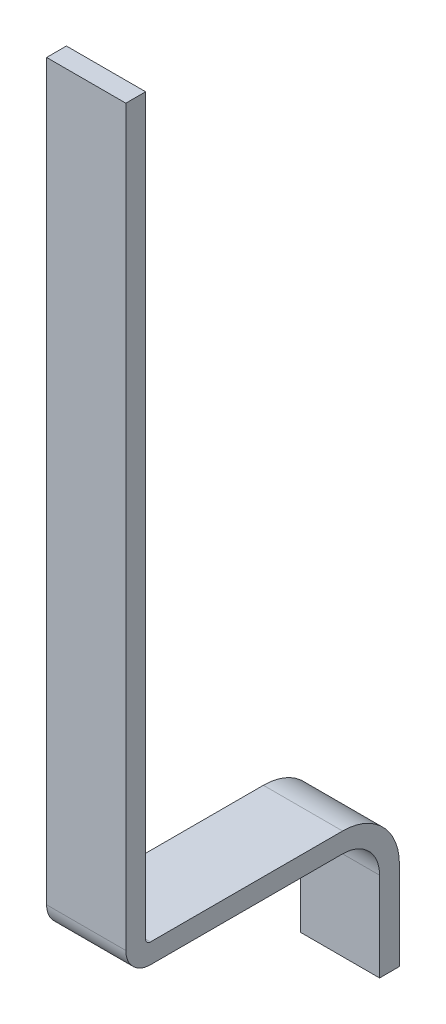
ISO-10303-21;
HEADER;
FILE_DESCRIPTION(('STEP AP214'),'2;1');
FILE_NAME('part.step','',(''),(''),'','','');
FILE_SCHEMA(('AUTOMOTIVE_DESIGN { 1 0 10303 214 1 1 1 1 }'));
ENDSEC;
DATA;
#1=APPLICATION_CONTEXT('core data for automotive mechanical design processes');
#2=APPLICATION_PROTOCOL_DEFINITION('international standard','automotive_design',2000,#1);
#3=PRODUCT_CONTEXT('',#1,'mechanical');
#4=PRODUCT('Part','Part','',(#3));
#5=PRODUCT_RELATED_PRODUCT_CATEGORY('part','',(#4));
#6=PRODUCT_DEFINITION_FORMATION('','',#4);
#7=PRODUCT_DEFINITION_CONTEXT('part definition',#1,'design');
#8=PRODUCT_DEFINITION('design','',#6,#7);
#9=PRODUCT_DEFINITION_SHAPE('','',#8);
#10=(LENGTH_UNIT() NAMED_UNIT(*) SI_UNIT(.MILLI.,.METRE.));
#11=(NAMED_UNIT(*) PLANE_ANGLE_UNIT() SI_UNIT($,.RADIAN.));
#12=(NAMED_UNIT(*) SI_UNIT($,.STERADIAN.) SOLID_ANGLE_UNIT());
#13=UNCERTAINTY_MEASURE_WITH_UNIT(LENGTH_MEASURE(1.E-05),#10,'distance_accuracy_value','');
#14=(GEOMETRIC_REPRESENTATION_CONTEXT(3) GLOBAL_UNCERTAINTY_ASSIGNED_CONTEXT((#13)) GLOBAL_UNIT_ASSIGNED_CONTEXT((#10,
#11,#12)) REPRESENTATION_CONTEXT('',''));
#15=CARTESIAN_POINT('',(0.,0.,0.));
#16=DIRECTION('',(0.,0.,1.));
#17=DIRECTION('',(1.,0.,0.));
#18=AXIS2_PLACEMENT_3D('',#15,#16,#17);
#19=CARTESIAN_POINT('',(0.4,-0.643753640552,-0.07458478699637));
#20=DIRECTION('',(1.,0.,0.));
#21=DIRECTION('',(0.,-1.,0.));
#22=AXIS2_PLACEMENT_3D('',#19,#20,#21);
#23=PLANE('',#22);
#24=DIRECTION('',(0.,1.,0.));
#25=VECTOR('',#24,1.);
#26=CARTESIAN_POINT('',(0.4,-1.805851747482,0.16));
#27=LINE('',#26,#25);
#28=CARTESIAN_POINT('',(0.4,-1.805851747482,0.16));
#29=VERTEX_POINT('',#28);
#30=CARTESIAN_POINT('',(0.4,1.9,0.16));
#31=VERTEX_POINT('',#30);
#32=EDGE_CURVE('E153',#29,#31,#27,.T.);
#33=ORIENTED_EDGE('',*,*,#32,.T.);
#34=DIRECTION('',(0.,0.,1.));
#35=VECTOR('',#34,1.);
#36=CARTESIAN_POINT('',(0.4,1.9,0.16));
#37=LINE('',#36,#35);
#38=CARTESIAN_POINT('',(0.4,1.9,0.26));
#39=VERTEX_POINT('',#38);
#40=EDGE_CURVE('E174',#31,#39,#37,.T.);
#41=ORIENTED_EDGE('',*,*,#40,.T.);
#42=DIRECTION('',(0.,-1.,0.));
#43=VECTOR('',#42,1.);
#44=CARTESIAN_POINT('',(0.4,1.9,0.26));
#45=LINE('',#44,#43);
#46=CARTESIAN_POINT('',(0.4,-1.805851747482,0.26));
#47=VERTEX_POINT('',#46);
#48=EDGE_CURVE('E183',#39,#47,#45,.T.);
#49=ORIENTED_EDGE('',*,*,#48,.T.);
#50=CARTESIAN_POINT('',(0.4,-1.805851747482,0.135287023696));
#51=DIRECTION('',(1.,0.,0.));
#52=DIRECTION('',(0.,1.,0.));
#53=AXIS2_PLACEMENT_3D('',#50,#51,#52);
#54=CIRCLE('',#53,0.124712976304);
#55=CARTESIAN_POINT('',(0.4,-1.930564723786,0.135287023696));
#56=VERTEX_POINT('',#55);
#57=EDGE_CURVE('E162',#47,#56,#54,.T.);
#58=ORIENTED_EDGE('',*,*,#57,.T.);
#59=DIRECTION('',(0.,0.,-1.));
#60=VECTOR('',#59,1.);
#61=CARTESIAN_POINT('',(0.4,-1.930564723786,0.135287023696));
#62=LINE('',#61,#60);
#63=CARTESIAN_POINT('',(0.4,-1.930564723786,-0.834763344159));
#64=VERTEX_POINT('',#63);
#65=EDGE_CURVE('E210',#56,#64,#62,.T.);
#66=ORIENTED_EDGE('',*,*,#65,.T.);
#67=CARTESIAN_POINT('',(0.4,-2.117351316963,-0.834763344159));
#68=DIRECTION('',(1.,0.,0.));
#69=DIRECTION('',(0.,1.,0.));
#70=AXIS2_PLACEMENT_3D('',#67,#68,#69);
#71=CIRCLE('',#70,0.186786593177);
#72=CARTESIAN_POINT('',(0.4,-2.117351316963,-1.021549937336));
#73=VERTEX_POINT('',#72);
#74=EDGE_CURVE('E191',#73,#64,#71,.T.);
#75=ORIENTED_EDGE('',*,*,#74,.F.);
#76=DIRECTION('',(0.,-1.,0.));
#77=VECTOR('',#76,1.);
#78=CARTESIAN_POINT('',(0.4,-2.117351316963,-1.021549937336));
#79=LINE('',#78,#77);
#80=CARTESIAN_POINT('',(0.4,-2.566872544918,-1.021549937336));
#81=VERTEX_POINT('',#80);
#82=EDGE_CURVE('E232',#73,#81,#79,.T.);
#83=ORIENTED_EDGE('',*,*,#82,.T.);
#84=DIRECTION('',(0.,0.,-1.));
#85=VECTOR('',#84,1.);
#86=CARTESIAN_POINT('',(0.4,-2.566872544918,-1.021549937336));
#87=LINE('',#86,#85);
#88=CARTESIAN_POINT('',(0.4,-2.566872544918,-1.121549937336));
#89=VERTEX_POINT('',#88);
#90=EDGE_CURVE('E244',#81,#89,#87,.T.);
#91=ORIENTED_EDGE('',*,*,#90,.T.);
#92=DIRECTION('',(0.,1.,0.));
#93=VECTOR('',#92,1.);
#94=CARTESIAN_POINT('',(0.4,-2.566872544918,-1.121549937336));
#95=LINE('',#94,#93);
#96=CARTESIAN_POINT('',(0.4,-2.117351316963,-1.121549937336));
#97=VERTEX_POINT('',#96);
#98=EDGE_CURVE('E211',#89,#97,#95,.T.);
#99=ORIENTED_EDGE('',*,*,#98,.T.);
#100=CARTESIAN_POINT('',(0.4,-2.117351316963,-0.834763344159));
#101=DIRECTION('',(1.,0.,0.));
#102=DIRECTION('',(0.,1.,0.));
#103=AXIS2_PLACEMENT_3D('',#100,#101,#102);
#104=CIRCLE('',#103,0.286786593177);
#105=CARTESIAN_POINT('',(0.4,-1.830564723786,-0.834763344159));
#106=VERTEX_POINT('',#105);
#107=EDGE_CURVE('E262',#97,#106,#104,.T.);
#108=ORIENTED_EDGE('',*,*,#107,.T.);
#109=DIRECTION('',(0.,0.,1.));
#110=VECTOR('',#109,1.);
#111=CARTESIAN_POINT('',(0.4,-1.830564723786,-0.834763344159));
#112=LINE('',#111,#110);
#113=CARTESIAN_POINT('',(0.4,-1.830564723786,0.135287023696));
#114=VERTEX_POINT('',#113);
#115=EDGE_CURVE('E138',#106,#114,#112,.T.);
#116=ORIENTED_EDGE('',*,*,#115,.T.);
#117=CARTESIAN_POINT('',(0.4,-1.805851747482,0.135287023696));
#118=DIRECTION('',(1.,0.,0.));
#119=DIRECTION('',(0.,1.,0.));
#120=AXIS2_PLACEMENT_3D('',#117,#118,#119);
#121=CIRCLE('',#120,0.02471297630395);
#122=EDGE_CURVE('E11',#29,#114,#121,.T.);
#123=ORIENTED_EDGE('',*,*,#122,.F.);
#124=EDGE_LOOP('',(#33,#41,#49,#58,#66,#75,#83,#91,#99,#108,#116,#123));
#125=FACE_BOUND('',#124,.T.);
#126=ADVANCED_FACE('F17',(#125),#23,.T.);
#127=CARTESIAN_POINT('',(0.,-0.643753640552,-0.07458478699637));
#128=DIRECTION('',(1.,0.,0.));
#129=DIRECTION('',(0.,-1.,0.));
#130=AXIS2_PLACEMENT_3D('',#127,#128,#129);
#131=PLANE('',#130);
#132=DIRECTION('',(0.,1.,0.));
#133=VECTOR('',#132,1.);
#134=CARTESIAN_POINT('',(0.,-1.805851747482,0.16));
#135=LINE('',#134,#133);
#136=CARTESIAN_POINT('',(0.,-1.805851747482,0.16));
#137=VERTEX_POINT('',#136);
#138=CARTESIAN_POINT('',(0.,1.9,0.16));
#139=VERTEX_POINT('',#138);
#140=EDGE_CURVE('E140',#137,#139,#135,.T.);
#141=ORIENTED_EDGE('',*,*,#140,.F.);
#142=CARTESIAN_POINT('',(0.,-1.805851747482,0.135287023696));
#143=DIRECTION('',(1.,0.,0.));
#144=DIRECTION('',(0.,1.,0.));
#145=AXIS2_PLACEMENT_3D('',#142,#143,#144);
#146=CIRCLE('',#145,0.02471297630395);
#147=CARTESIAN_POINT('',(0.,-1.830564723786,0.135287023696));
#148=VERTEX_POINT('',#147);
#149=EDGE_CURVE('E21',#137,#148,#146,.T.);
#150=ORIENTED_EDGE('',*,*,#149,.T.);
#151=DIRECTION('',(0.,0.,1.));
#152=VECTOR('',#151,1.);
#153=CARTESIAN_POINT('',(0.,-1.830564723786,-0.834763344159));
#154=LINE('',#153,#152);
#155=CARTESIAN_POINT('',(0.,-1.830564723786,-0.834763344159));
#156=VERTEX_POINT('',#155);
#157=EDGE_CURVE('E266',#156,#148,#154,.T.);
#158=ORIENTED_EDGE('',*,*,#157,.F.);
#159=CARTESIAN_POINT('',(0.,-2.117351316963,-0.834763344159));
#160=DIRECTION('',(1.,0.,0.));
#161=DIRECTION('',(0.,1.,0.));
#162=AXIS2_PLACEMENT_3D('',#159,#160,#161);
#163=CIRCLE('',#162,0.286786593177);
#164=CARTESIAN_POINT('',(0.,-2.117351316963,-1.121549937336));
#165=VERTEX_POINT('',#164);
#166=EDGE_CURVE('E215',#165,#156,#163,.T.);
#167=ORIENTED_EDGE('',*,*,#166,.F.);
#168=DIRECTION('',(0.,1.,0.));
#169=VECTOR('',#168,1.);
#170=CARTESIAN_POINT('',(0.,-2.566872544918,-1.121549937336));
#171=LINE('',#170,#169);
#172=CARTESIAN_POINT('',(0.,-2.566872544918,-1.121549937336));
#173=VERTEX_POINT('',#172);
#174=EDGE_CURVE('E248',#173,#165,#171,.T.);
#175=ORIENTED_EDGE('',*,*,#174,.F.);
#176=DIRECTION('',(0.,0.,-1.));
#177=VECTOR('',#176,1.);
#178=CARTESIAN_POINT('',(0.,-2.566872544918,-1.021549937336));
#179=LINE('',#178,#177);
#180=CARTESIAN_POINT('',(0.,-2.566872544918,-1.021549937336));
#181=VERTEX_POINT('',#180);
#182=EDGE_CURVE('E236',#181,#173,#179,.T.);
#183=ORIENTED_EDGE('',*,*,#182,.F.);
#184=DIRECTION('',(0.,-1.,0.));
#185=VECTOR('',#184,1.);
#186=CARTESIAN_POINT('',(0.,-2.117351316963,-1.021549937336));
#187=LINE('',#186,#185);
#188=CARTESIAN_POINT('',(0.,-2.117351316963,-1.021549937336));
#189=VERTEX_POINT('',#188);
#190=EDGE_CURVE('E224',#189,#181,#187,.T.);
#191=ORIENTED_EDGE('',*,*,#190,.F.);
#192=CARTESIAN_POINT('',(0.,-2.117351316963,-0.834763344159));
#193=DIRECTION('',(1.,0.,0.));
#194=DIRECTION('',(0.,1.,0.));
#195=AXIS2_PLACEMENT_3D('',#192,#193,#194);
#196=CIRCLE('',#195,0.186786593177);
#197=CARTESIAN_POINT('',(0.,-1.930564723786,-0.834763344159));
#198=VERTEX_POINT('',#197);
#199=EDGE_CURVE('E192',#189,#198,#196,.T.);
#200=ORIENTED_EDGE('',*,*,#199,.T.);
#201=DIRECTION('',(0.,0.,-1.));
#202=VECTOR('',#201,1.);
#203=CARTESIAN_POINT('',(0.,-1.930564723786,0.135287023696));
#204=LINE('',#203,#202);
#205=CARTESIAN_POINT('',(0.,-1.930564723786,0.135287023696));
#206=VERTEX_POINT('',#205);
#207=EDGE_CURVE('E159',#206,#198,#204,.T.);
#208=ORIENTED_EDGE('',*,*,#207,.F.);
#209=CARTESIAN_POINT('',(0.,-1.805851747482,0.135287023696));
#210=DIRECTION('',(1.,0.,0.));
#211=DIRECTION('',(0.,1.,0.));
#212=AXIS2_PLACEMENT_3D('',#209,#210,#211);
#213=CIRCLE('',#212,0.124712976304);
#214=CARTESIAN_POINT('',(0.,-1.805851747482,0.26));
#215=VERTEX_POINT('',#214);
#216=EDGE_CURVE('E197',#215,#206,#213,.T.);
#217=ORIENTED_EDGE('',*,*,#216,.F.);
#218=DIRECTION('',(0.,-1.,0.));
#219=VECTOR('',#218,1.);
#220=CARTESIAN_POINT('',(0.,1.9,0.26));
#221=LINE('',#220,#219);
#222=CARTESIAN_POINT('',(0.,1.9,0.26));
#223=VERTEX_POINT('',#222);
#224=EDGE_CURVE('E178',#223,#215,#221,.T.);
#225=ORIENTED_EDGE('',*,*,#224,.F.);
#226=DIRECTION('',(0.,0.,1.));
#227=VECTOR('',#226,1.);
#228=CARTESIAN_POINT('',(0.,1.9,0.16));
#229=LINE('',#228,#227);
#230=EDGE_CURVE('E143',#139,#223,#229,.T.);
#231=ORIENTED_EDGE('',*,*,#230,.F.);
#232=EDGE_LOOP('',(#141,#150,#158,#167,#175,#183,#191,#200,#208,#217,#225,#231));
#233=FACE_BOUND('',#232,.T.);
#234=ADVANCED_FACE('F141',(#233),#131,.F.);
#235=CARTESIAN_POINT('',(0.,-1.805851747482,0.135287023696));
#236=DIRECTION('',(-1.,0.,0.));
#237=DIRECTION('',(0.,1.,0.));
#238=AXIS2_PLACEMENT_3D('',#235,#236,#237);
#239=CYLINDRICAL_SURFACE('',#238,0.02471297630395);
#240=ORIENTED_EDGE('',*,*,#149,.F.);
#241=DIRECTION('',(1.,0.,0.));
#242=VECTOR('',#241,1.);
#243=CARTESIAN_POINT('',(0.,-1.805851747482,0.16));
#244=LINE('',#243,#242);
#245=EDGE_CURVE('E133',#137,#29,#244,.T.);
#246=ORIENTED_EDGE('',*,*,#245,.T.);
#247=ORIENTED_EDGE('',*,*,#122,.T.);
#248=DIRECTION('',(1.,0.,0.));
#249=VECTOR('',#248,1.);
#250=CARTESIAN_POINT('',(0.,-1.830564723786,0.135287023696));
#251=LINE('',#250,#249);
#252=EDGE_CURVE('E135',#148,#114,#251,.T.);
#253=ORIENTED_EDGE('',*,*,#252,.F.);
#254=EDGE_LOOP('',(#240,#246,#247,#253));
#255=FACE_BOUND('',#254,.T.);
#256=ADVANCED_FACE('F19',(#255),#239,.F.);
#257=CARTESIAN_POINT('',(0.,-1.830564723786,-0.834763344159));
#258=DIRECTION('',(0.,-1.,0.));
#259=DIRECTION('',(-1.,0.,0.));
#260=AXIS2_PLACEMENT_3D('',#257,#258,#259);
#261=PLANE('',#260);
#262=DIRECTION('',(1.,0.,0.));
#263=VECTOR('',#262,1.);
#264=CARTESIAN_POINT('',(0.,-1.830564723786,-0.834763344159));
#265=LINE('',#264,#263);
#266=EDGE_CURVE('E258',#156,#106,#265,.T.);
#267=ORIENTED_EDGE('',*,*,#266,.F.);
#268=ORIENTED_EDGE('',*,*,#157,.T.);
#269=ORIENTED_EDGE('',*,*,#252,.T.);
#270=ORIENTED_EDGE('',*,*,#115,.F.);
#271=EDGE_LOOP('',(#267,#268,#269,#270));
#272=FACE_BOUND('',#271,.T.);
#273=ADVANCED_FACE('F275',(#272),#261,.F.);
#274=CARTESIAN_POINT('',(0.,-2.117351316963,-0.834763344159));
#275=DIRECTION('',(-1.,0.,0.));
#276=DIRECTION('',(0.,1.,0.));
#277=AXIS2_PLACEMENT_3D('',#274,#275,#276);
#278=CYLINDRICAL_SURFACE('',#277,0.286786593177);
#279=DIRECTION('',(1.,0.,0.));
#280=VECTOR('',#279,1.);
#281=CARTESIAN_POINT('',(0.,-2.117351316963,-1.121549937336));
#282=LINE('',#281,#280);
#283=EDGE_CURVE('E216',#165,#97,#282,.T.);
#284=ORIENTED_EDGE('',*,*,#283,.F.);
#285=ORIENTED_EDGE('',*,*,#166,.T.);
#286=ORIENTED_EDGE('',*,*,#266,.T.);
#287=ORIENTED_EDGE('',*,*,#107,.F.);
#288=EDGE_LOOP('',(#284,#285,#286,#287));
#289=FACE_BOUND('',#288,.T.);
#290=ADVANCED_FACE('F279',(#289),#278,.T.);
#291=CARTESIAN_POINT('',(0.,-2.566872544918,-1.121549937336));
#292=DIRECTION('',(0.,0.,1.));
#293=DIRECTION('',(0.,-1.,0.));
#294=AXIS2_PLACEMENT_3D('',#291,#292,#293);
#295=PLANE('',#294);
#296=DIRECTION('',(1.,0.,0.));
#297=VECTOR('',#296,1.);
#298=CARTESIAN_POINT('',(0.,-2.566872544918,-1.121549937336));
#299=LINE('',#298,#297);
#300=EDGE_CURVE('E240',#173,#89,#299,.T.);
#301=ORIENTED_EDGE('',*,*,#300,.F.);
#302=ORIENTED_EDGE('',*,*,#174,.T.);
#303=ORIENTED_EDGE('',*,*,#283,.T.);
#304=ORIENTED_EDGE('',*,*,#98,.F.);
#305=EDGE_LOOP('',(#301,#302,#303,#304));
#306=FACE_BOUND('',#305,.T.);
#307=ADVANCED_FACE('F281',(#306),#295,.F.);
#308=CARTESIAN_POINT('',(0.,-2.566872544918,-1.021549937336));
#309=DIRECTION('',(0.,1.,0.));
#310=DIRECTION('',(1.,0.,0.));
#311=AXIS2_PLACEMENT_3D('',#308,#309,#310);
#312=PLANE('',#311);
#313=DIRECTION('',(1.,0.,0.));
#314=VECTOR('',#313,1.);
#315=CARTESIAN_POINT('',(0.,-2.566872544918,-1.021549937336));
#316=LINE('',#315,#314);
#317=EDGE_CURVE('E228',#181,#81,#316,.T.);
#318=ORIENTED_EDGE('',*,*,#317,.F.);
#319=ORIENTED_EDGE('',*,*,#182,.T.);
#320=ORIENTED_EDGE('',*,*,#300,.T.);
#321=ORIENTED_EDGE('',*,*,#90,.F.);
#322=EDGE_LOOP('',(#318,#319,#320,#321));
#323=FACE_BOUND('',#322,.T.);
#324=ADVANCED_FACE('F284',(#323),#312,.F.);
#325=CARTESIAN_POINT('',(0.,-2.117351316963,-1.021549937336));
#326=DIRECTION('',(0.,0.,-1.));
#327=DIRECTION('',(0.,-1.,0.));
#328=AXIS2_PLACEMENT_3D('',#325,#326,#327);
#329=PLANE('',#328);
#330=DIRECTION('',(1.,0.,0.));
#331=VECTOR('',#330,1.);
#332=CARTESIAN_POINT('',(0.,-2.117351316963,-1.021549937336));
#333=LINE('',#332,#331);
#334=EDGE_CURVE('E187',#189,#73,#333,.T.);
#335=ORIENTED_EDGE('',*,*,#334,.F.);
#336=ORIENTED_EDGE('',*,*,#190,.T.);
#337=ORIENTED_EDGE('',*,*,#317,.T.);
#338=ORIENTED_EDGE('',*,*,#82,.F.);
#339=EDGE_LOOP('',(#335,#336,#337,#338));
#340=FACE_BOUND('',#339,.T.);
#341=ADVANCED_FACE('F289',(#340),#329,.F.);
#342=CARTESIAN_POINT('',(0.,-2.117351316963,-0.834763344159));
#343=DIRECTION('',(-1.,0.,0.));
#344=DIRECTION('',(0.,1.,0.));
#345=AXIS2_PLACEMENT_3D('',#342,#343,#344);
#346=CYLINDRICAL_SURFACE('',#345,0.186786593177);
#347=ORIENTED_EDGE('',*,*,#199,.F.);
#348=ORIENTED_EDGE('',*,*,#334,.T.);
#349=ORIENTED_EDGE('',*,*,#74,.T.);
#350=DIRECTION('',(1.,0.,0.));
#351=VECTOR('',#350,1.);
#352=CARTESIAN_POINT('',(0.,-1.930564723786,-0.834763344159));
#353=LINE('',#352,#351);
#354=EDGE_CURVE('E161',#198,#64,#353,.T.);
#355=ORIENTED_EDGE('',*,*,#354,.F.);
#356=EDGE_LOOP('',(#347,#348,#349,#355));
#357=FACE_BOUND('',#356,.T.);
#358=ADVANCED_FACE('F292',(#357),#346,.F.);
#359=CARTESIAN_POINT('',(0.,-1.930564723786,0.135287023696));
#360=DIRECTION('',(0.,1.,0.));
#361=DIRECTION('',(1.,0.,0.));
#362=AXIS2_PLACEMENT_3D('',#359,#360,#361);
#363=PLANE('',#362);
#364=DIRECTION('',(1.,0.,0.));
#365=VECTOR('',#364,1.);
#366=CARTESIAN_POINT('',(0.,-1.930564723786,0.135287023696));
#367=LINE('',#366,#365);
#368=EDGE_CURVE('E193',#206,#56,#367,.T.);
#369=ORIENTED_EDGE('',*,*,#368,.F.);
#370=ORIENTED_EDGE('',*,*,#207,.T.);
#371=ORIENTED_EDGE('',*,*,#354,.T.);
#372=ORIENTED_EDGE('',*,*,#65,.F.);
#373=EDGE_LOOP('',(#369,#370,#371,#372));
#374=FACE_BOUND('',#373,.T.);
#375=ADVANCED_FACE('F295',(#374),#363,.F.);
#376=CARTESIAN_POINT('',(0.,-1.805851747482,0.135287023696));
#377=DIRECTION('',(-1.,0.,0.));
#378=DIRECTION('',(0.,1.,0.));
#379=AXIS2_PLACEMENT_3D('',#376,#377,#378);
#380=CYLINDRICAL_SURFACE('',#379,0.124712976304);
#381=DIRECTION('',(1.,0.,0.));
#382=VECTOR('',#381,1.);
#383=CARTESIAN_POINT('',(0.,-1.805851747482,0.26));
#384=LINE('',#383,#382);
#385=EDGE_CURVE('E179',#215,#47,#384,.T.);
#386=ORIENTED_EDGE('',*,*,#385,.F.);
#387=ORIENTED_EDGE('',*,*,#216,.T.);
#388=ORIENTED_EDGE('',*,*,#368,.T.);
#389=ORIENTED_EDGE('',*,*,#57,.F.);
#390=EDGE_LOOP('',(#386,#387,#388,#389));
#391=FACE_BOUND('',#390,.T.);
#392=ADVANCED_FACE('F299',(#391),#380,.T.);
#393=CARTESIAN_POINT('',(0.,1.9,0.26));
#394=DIRECTION('',(0.,0.,-1.));
#395=DIRECTION('',(0.,-1.,0.));
#396=AXIS2_PLACEMENT_3D('',#393,#394,#395);
#397=PLANE('',#396);
#398=DIRECTION('',(1.,0.,0.));
#399=VECTOR('',#398,1.);
#400=CARTESIAN_POINT('',(0.,1.9,0.26));
#401=LINE('',#400,#399);
#402=EDGE_CURVE('E170',#223,#39,#401,.T.);
#403=ORIENTED_EDGE('',*,*,#402,.F.);
#404=ORIENTED_EDGE('',*,*,#224,.T.);
#405=ORIENTED_EDGE('',*,*,#385,.T.);
#406=ORIENTED_EDGE('',*,*,#48,.F.);
#407=EDGE_LOOP('',(#403,#404,#405,#406));
#408=FACE_BOUND('',#407,.T.);
#409=ADVANCED_FACE('F301',(#408),#397,.F.);
#410=CARTESIAN_POINT('',(0.,1.9,0.16));
#411=DIRECTION('',(0.,-1.,0.));
#412=DIRECTION('',(-1.,0.,0.));
#413=AXIS2_PLACEMENT_3D('',#410,#411,#412);
#414=PLANE('',#413);
#415=DIRECTION('',(1.,0.,0.));
#416=VECTOR('',#415,1.);
#417=CARTESIAN_POINT('',(0.,1.9,0.16));
#418=LINE('',#417,#416);
#419=EDGE_CURVE('E148',#139,#31,#418,.T.);
#420=ORIENTED_EDGE('',*,*,#419,.F.);
#421=ORIENTED_EDGE('',*,*,#230,.T.);
#422=ORIENTED_EDGE('',*,*,#402,.T.);
#423=ORIENTED_EDGE('',*,*,#40,.F.);
#424=EDGE_LOOP('',(#420,#421,#422,#423));
#425=FACE_BOUND('',#424,.T.);
#426=ADVANCED_FACE('F303',(#425),#414,.F.);
#427=CARTESIAN_POINT('',(0.,-1.805851747482,0.16));
#428=DIRECTION('',(0.,0.,1.));
#429=DIRECTION('',(0.,-1.,0.));
#430=AXIS2_PLACEMENT_3D('',#427,#428,#429);
#431=PLANE('',#430);
#432=ORIENTED_EDGE('',*,*,#245,.F.);
#433=ORIENTED_EDGE('',*,*,#140,.T.);
#434=ORIENTED_EDGE('',*,*,#419,.T.);
#435=ORIENTED_EDGE('',*,*,#32,.F.);
#436=EDGE_LOOP('',(#432,#433,#434,#435));
#437=FACE_BOUND('',#436,.T.);
#438=ADVANCED_FACE('F151',(#437),#431,.F.);
#439=CLOSED_SHELL('',(#126,#234,#256,#273,#290,#307,#324,#341,#358,#375,#392,#409,#426,#438));
#440=MANIFOLD_SOLID_BREP('B1',#439);
#441=ADVANCED_BREP_SHAPE_REPRESENTATION('',(#18,#440),#14);
#442=SHAPE_DEFINITION_REPRESENTATION(#9,#441);
ENDSEC;
END-ISO-10303-21;
